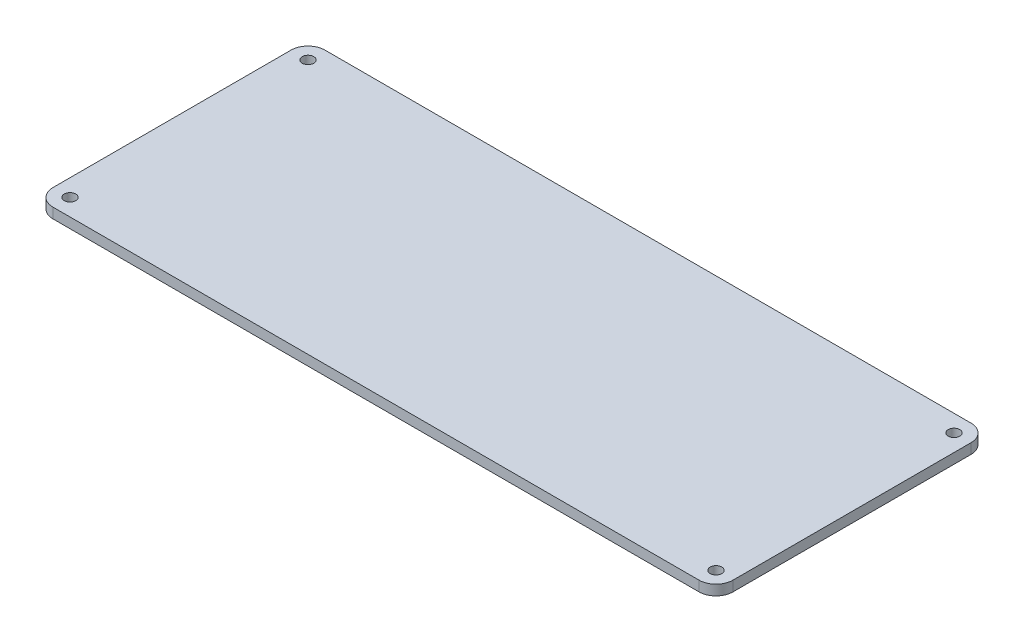
ISO-10303-21;
HEADER;
FILE_DESCRIPTION(('STEP AP214'),'2;1');
FILE_NAME('part.step','',(''),(''),'','','');
FILE_SCHEMA(('AUTOMOTIVE_DESIGN { 1 0 10303 214 1 1 1 1 }'));
ENDSEC;
DATA;
#1=APPLICATION_CONTEXT('core data for automotive mechanical design processes');
#2=APPLICATION_PROTOCOL_DEFINITION('international standard','automotive_design',2000,#1);
#3=PRODUCT_CONTEXT('',#1,'mechanical');
#4=PRODUCT('Part','Part','',(#3));
#5=PRODUCT_RELATED_PRODUCT_CATEGORY('part','',(#4));
#6=PRODUCT_DEFINITION_FORMATION('','',#4);
#7=PRODUCT_DEFINITION_CONTEXT('part definition',#1,'design');
#8=PRODUCT_DEFINITION('design','',#6,#7);
#9=PRODUCT_DEFINITION_SHAPE('','',#8);
#10=(LENGTH_UNIT() NAMED_UNIT(*) SI_UNIT(.MILLI.,.METRE.));
#11=(NAMED_UNIT(*) PLANE_ANGLE_UNIT() SI_UNIT($,.RADIAN.));
#12=(NAMED_UNIT(*) SI_UNIT($,.STERADIAN.) SOLID_ANGLE_UNIT());
#13=UNCERTAINTY_MEASURE_WITH_UNIT(LENGTH_MEASURE(1.E-05),#10,'distance_accuracy_value','');
#14=(GEOMETRIC_REPRESENTATION_CONTEXT(3) GLOBAL_UNCERTAINTY_ASSIGNED_CONTEXT((#13)) GLOBAL_UNIT_ASSIGNED_CONTEXT((#10,
#11,#12)) REPRESENTATION_CONTEXT('',''));
#15=CARTESIAN_POINT('',(0.,0.,0.));
#16=DIRECTION('',(0.,0.,1.));
#17=DIRECTION('',(1.,0.,0.));
#18=AXIS2_PLACEMENT_3D('',#15,#16,#17);
#19=CARTESIAN_POINT('',(0.,3.,0.));
#20=DIRECTION('',(1.,0.,0.));
#21=DIRECTION('',(0.,0.,-1.));
#22=AXIS2_PLACEMENT_3D('',#19,#20,#21);
#23=PLANE('',#22);
#24=DIRECTION('',(0.,0.,1.));
#25=VECTOR('',#24,1.);
#26=CARTESIAN_POINT('',(0.,3.,0.));
#27=LINE('',#26,#25);
#28=CARTESIAN_POINT('',(0.,3.,-75.));
#29=VERTEX_POINT('',#28);
#30=CARTESIAN_POINT('',(0.,3.,-5.));
#31=VERTEX_POINT('',#30);
#32=EDGE_CURVE('E127',#29,#31,#27,.T.);
#33=ORIENTED_EDGE('',*,*,#32,.F.);
#34=DIRECTION('',(0.,-1.,0.));
#35=VECTOR('',#34,1.);
#36=CARTESIAN_POINT('',(0.,3.,-75.));
#37=LINE('',#36,#35);
#38=CARTESIAN_POINT('',(0.,0.,-75.));
#39=VERTEX_POINT('',#38);
#40=EDGE_CURVE('E111',#29,#39,#37,.T.);
#41=ORIENTED_EDGE('',*,*,#40,.T.);
#42=DIRECTION('',(0.,0.,1.));
#43=VECTOR('',#42,1.);
#44=CARTESIAN_POINT('',(0.,0.,0.));
#45=LINE('',#44,#43);
#46=CARTESIAN_POINT('',(0.,0.,-5.));
#47=VERTEX_POINT('',#46);
#48=EDGE_CURVE('E124',#39,#47,#45,.T.);
#49=ORIENTED_EDGE('',*,*,#48,.T.);
#50=DIRECTION('',(0.,-1.,0.));
#51=VECTOR('',#50,1.);
#52=CARTESIAN_POINT('',(0.,3.,-5.));
#53=LINE('',#52,#51);
#54=EDGE_CURVE('E130',#47,#31,#53,.F.);
#55=ORIENTED_EDGE('',*,*,#54,.T.);
#56=EDGE_LOOP('',(#33,#41,#49,#55));
#57=FACE_BOUND('',#56,.T.);
#58=ADVANCED_FACE('F39',(#57),#23,.F.);
#59=CARTESIAN_POINT('',(0.,3.,0.));
#60=DIRECTION('',(0.,0.,-1.));
#61=DIRECTION('',(-1.,0.,0.));
#62=AXIS2_PLACEMENT_3D('',#59,#60,#61);
#63=PLANE('',#62);
#64=DIRECTION('',(1.,0.,0.));
#65=VECTOR('',#64,1.);
#66=CARTESIAN_POINT('',(0.,3.,0.));
#67=LINE('',#66,#65);
#68=CARTESIAN_POINT('',(5.,3.,0.));
#69=VERTEX_POINT('',#68);
#70=CARTESIAN_POINT('',(195.,3.,0.));
#71=VERTEX_POINT('',#70);
#72=EDGE_CURVE('E218',#69,#71,#67,.T.);
#73=ORIENTED_EDGE('',*,*,#72,.F.);
#74=DIRECTION('',(0.,-1.,0.));
#75=VECTOR('',#74,1.);
#76=CARTESIAN_POINT('',(5.,3.,0.));
#77=LINE('',#76,#75);
#78=CARTESIAN_POINT('',(5.,0.,0.));
#79=VERTEX_POINT('',#78);
#80=EDGE_CURVE('E183',#69,#79,#77,.T.);
#81=ORIENTED_EDGE('',*,*,#80,.T.);
#82=DIRECTION('',(1.,0.,0.));
#83=VECTOR('',#82,1.);
#84=CARTESIAN_POINT('',(0.,0.,0.));
#85=LINE('',#84,#83);
#86=CARTESIAN_POINT('',(195.,0.,0.));
#87=VERTEX_POINT('',#86);
#88=EDGE_CURVE('E135',#79,#87,#85,.T.);
#89=ORIENTED_EDGE('',*,*,#88,.T.);
#90=DIRECTION('',(0.,-1.,0.));
#91=VECTOR('',#90,1.);
#92=CARTESIAN_POINT('',(195.,3.,0.));
#93=LINE('',#92,#91);
#94=EDGE_CURVE('E180',#87,#71,#93,.F.);
#95=ORIENTED_EDGE('',*,*,#94,.T.);
#96=EDGE_LOOP('',(#73,#81,#89,#95));
#97=FACE_BOUND('',#96,.T.);
#98=ADVANCED_FACE('F239',(#97),#63,.F.);
#99=CARTESIAN_POINT('',(200.,3.,0.));
#100=DIRECTION('',(-1.,0.,0.));
#101=DIRECTION('',(0.,0.,1.));
#102=AXIS2_PLACEMENT_3D('',#99,#100,#101);
#103=PLANE('',#102);
#104=DIRECTION('',(0.,0.,-1.));
#105=VECTOR('',#104,1.);
#106=CARTESIAN_POINT('',(200.,0.,0.));
#107=LINE('',#106,#105);
#108=CARTESIAN_POINT('',(200.,0.,-5.));
#109=VERTEX_POINT('',#108);
#110=CARTESIAN_POINT('',(200.,0.,-75.));
#111=VERTEX_POINT('',#110);
#112=EDGE_CURVE('E141',#109,#111,#107,.T.);
#113=ORIENTED_EDGE('',*,*,#112,.T.);
#114=DIRECTION('',(0.,-1.,0.));
#115=VECTOR('',#114,1.);
#116=CARTESIAN_POINT('',(200.,3.,-75.));
#117=LINE('',#116,#115);
#118=CARTESIAN_POINT('',(200.,3.,-75.));
#119=VERTEX_POINT('',#118);
#120=EDGE_CURVE('E11',#111,#119,#117,.F.);
#121=ORIENTED_EDGE('',*,*,#120,.T.);
#122=DIRECTION('',(0.,0.,-1.));
#123=VECTOR('',#122,1.);
#124=CARTESIAN_POINT('',(200.,3.,0.));
#125=LINE('',#124,#123);
#126=CARTESIAN_POINT('',(200.,3.,-5.));
#127=VERTEX_POINT('',#126);
#128=EDGE_CURVE('E220',#127,#119,#125,.T.);
#129=ORIENTED_EDGE('',*,*,#128,.F.);
#130=DIRECTION('',(0.,-1.,0.));
#131=VECTOR('',#130,1.);
#132=CARTESIAN_POINT('',(200.,3.,-5.));
#133=LINE('',#132,#131);
#134=EDGE_CURVE('E49',#127,#109,#133,.T.);
#135=ORIENTED_EDGE('',*,*,#134,.T.);
#136=EDGE_LOOP('',(#113,#121,#129,#135));
#137=FACE_BOUND('',#136,.T.);
#138=ADVANCED_FACE('F233',(#137),#103,.F.);
#139=CARTESIAN_POINT('',(0.,3.,-80.));
#140=DIRECTION('',(0.,0.,1.));
#141=DIRECTION('',(1.,0.,0.));
#142=AXIS2_PLACEMENT_3D('',#139,#140,#141);
#143=PLANE('',#142);
#144=DIRECTION('',(-1.,0.,0.));
#145=VECTOR('',#144,1.);
#146=CARTESIAN_POINT('',(0.,0.,-80.));
#147=LINE('',#146,#145);
#148=CARTESIAN_POINT('',(195.,0.,-80.));
#149=VERTEX_POINT('',#148);
#150=CARTESIAN_POINT('',(5.,0.,-80.));
#151=VERTEX_POINT('',#150);
#152=EDGE_CURVE('E152',#149,#151,#147,.T.);
#153=ORIENTED_EDGE('',*,*,#152,.T.);
#154=DIRECTION('',(0.,-1.,0.));
#155=VECTOR('',#154,1.);
#156=CARTESIAN_POINT('',(5.,3.,-80.));
#157=LINE('',#156,#155);
#158=CARTESIAN_POINT('',(5.,3.,-80.));
#159=VERTEX_POINT('',#158);
#160=EDGE_CURVE('E112',#151,#159,#157,.F.);
#161=ORIENTED_EDGE('',*,*,#160,.T.);
#162=DIRECTION('',(-1.,0.,0.));
#163=VECTOR('',#162,1.);
#164=CARTESIAN_POINT('',(0.,3.,-80.));
#165=LINE('',#164,#163);
#166=CARTESIAN_POINT('',(195.,3.,-80.));
#167=VERTEX_POINT('',#166);
#168=EDGE_CURVE('E147',#167,#159,#165,.T.);
#169=ORIENTED_EDGE('',*,*,#168,.F.);
#170=DIRECTION('',(0.,-1.,0.));
#171=VECTOR('',#170,1.);
#172=CARTESIAN_POINT('',(195.,3.,-80.));
#173=LINE('',#172,#171);
#174=EDGE_CURVE('E118',#167,#149,#173,.T.);
#175=ORIENTED_EDGE('',*,*,#174,.T.);
#176=EDGE_LOOP('',(#153,#161,#169,#175));
#177=FACE_BOUND('',#176,.T.);
#178=ADVANCED_FACE('F229',(#177),#143,.F.);
#179=CARTESIAN_POINT('',(0.,3.,0.));
#180=DIRECTION('',(0.,-1.,0.));
#181=DIRECTION('',(0.,0.,-1.));
#182=AXIS2_PLACEMENT_3D('',#179,#180,#181);
#183=PLANE('',#182);
#184=CARTESIAN_POINT('',(195.,3.,-5.));
#185=DIRECTION('',(0.,1.,0.));
#186=DIRECTION('',(0.,0.,1.));
#187=AXIS2_PLACEMENT_3D('',#184,#185,#186);
#188=CIRCLE('',#187,1.69999999999998);
#189=CARTESIAN_POINT('',(195.,3.,-3.30000000000002));
#190=VERTEX_POINT('',#189);
#191=EDGE_CURVE('E210',#190,#190,#188,.T.);
#192=ORIENTED_EDGE('',*,*,#191,.F.);
#193=EDGE_LOOP('',(#192));
#194=FACE_BOUND('',#193,.T.);
#195=CARTESIAN_POINT('',(5.,3.,-5.));
#196=DIRECTION('',(0.,1.,0.));
#197=DIRECTION('',(0.,0.,1.));
#198=AXIS2_PLACEMENT_3D('',#195,#196,#197);
#199=CIRCLE('',#198,1.69999999999999);
#200=CARTESIAN_POINT('',(5.,3.,-3.30000000000001));
#201=VERTEX_POINT('',#200);
#202=EDGE_CURVE('E197',#201,#201,#199,.T.);
#203=ORIENTED_EDGE('',*,*,#202,.F.);
#204=EDGE_LOOP('',(#203));
#205=FACE_BOUND('',#204,.T.);
#206=CARTESIAN_POINT('',(5.,3.,-75.));
#207=DIRECTION('',(0.,1.,0.));
#208=DIRECTION('',(0.,0.,1.));
#209=AXIS2_PLACEMENT_3D('',#206,#207,#208);
#210=CIRCLE('',#209,1.69999999999999);
#211=CARTESIAN_POINT('',(5.,3.,-73.3));
#212=VERTEX_POINT('',#211);
#213=EDGE_CURVE('E193',#212,#212,#210,.T.);
#214=ORIENTED_EDGE('',*,*,#213,.F.);
#215=EDGE_LOOP('',(#214));
#216=FACE_BOUND('',#215,.T.);
#217=CARTESIAN_POINT('',(195.,3.,-75.));
#218=DIRECTION('',(0.,1.,0.));
#219=DIRECTION('',(0.,0.,1.));
#220=AXIS2_PLACEMENT_3D('',#217,#218,#219);
#221=CIRCLE('',#220,1.69999999999998);
#222=CARTESIAN_POINT('',(195.,3.,-73.3));
#223=VERTEX_POINT('',#222);
#224=EDGE_CURVE('E144',#223,#223,#221,.T.);
#225=ORIENTED_EDGE('',*,*,#224,.F.);
#226=EDGE_LOOP('',(#225));
#227=FACE_BOUND('',#226,.T.);
#228=ORIENTED_EDGE('',*,*,#168,.T.);
#229=CARTESIAN_POINT('',(5.,3.,-75.));
#230=DIRECTION('',(0.,-1.,0.));
#231=DIRECTION('',(0.,0.,-1.));
#232=AXIS2_PLACEMENT_3D('',#229,#230,#231);
#233=CIRCLE('',#232,5.);
#234=EDGE_CURVE('E177',#159,#29,#233,.F.);
#235=ORIENTED_EDGE('',*,*,#234,.T.);
#236=ORIENTED_EDGE('',*,*,#32,.T.);
#237=CARTESIAN_POINT('',(5.,3.,-5.));
#238=DIRECTION('',(0.,-1.,0.));
#239=DIRECTION('',(0.,0.,-1.));
#240=AXIS2_PLACEMENT_3D('',#237,#238,#239);
#241=CIRCLE('',#240,5.);
#242=EDGE_CURVE('E174',#31,#69,#241,.F.);
#243=ORIENTED_EDGE('',*,*,#242,.T.);
#244=ORIENTED_EDGE('',*,*,#72,.T.);
#245=CARTESIAN_POINT('',(195.,3.,-5.));
#246=DIRECTION('',(0.,-1.,0.));
#247=DIRECTION('',(0.,0.,-1.));
#248=AXIS2_PLACEMENT_3D('',#245,#246,#247);
#249=CIRCLE('',#248,5.);
#250=EDGE_CURVE('E62',#71,#127,#249,.F.);
#251=ORIENTED_EDGE('',*,*,#250,.T.);
#252=ORIENTED_EDGE('',*,*,#128,.T.);
#253=CARTESIAN_POINT('',(195.,3.,-75.));
#254=DIRECTION('',(0.,-1.,0.));
#255=DIRECTION('',(0.,0.,-1.));
#256=AXIS2_PLACEMENT_3D('',#253,#254,#255);
#257=CIRCLE('',#256,5.);
#258=EDGE_CURVE('E171',#119,#167,#257,.F.);
#259=ORIENTED_EDGE('',*,*,#258,.T.);
#260=EDGE_LOOP('',(#228,#235,#236,#243,#244,#251,#252,#259));
#261=FACE_BOUND('',#260,.T.);
#262=ADVANCED_FACE('F226',(#194,#205,#216,#227,#261),#183,.F.);
#263=CARTESIAN_POINT('',(0.,0.,0.));
#264=DIRECTION('',(0.,-1.,0.));
#265=DIRECTION('',(0.,0.,-1.));
#266=AXIS2_PLACEMENT_3D('',#263,#264,#265);
#267=PLANE('',#266);
#268=CARTESIAN_POINT('',(195.,0.,-5.));
#269=DIRECTION('',(0.,-1.,0.));
#270=DIRECTION('',(0.,0.,-1.));
#271=AXIS2_PLACEMENT_3D('',#268,#269,#270);
#272=CIRCLE('',#271,1.69999999999998);
#273=CARTESIAN_POINT('',(195.,0.,-6.69999999999998));
#274=VERTEX_POINT('',#273);
#275=EDGE_CURVE('E43',#274,#274,#272,.T.);
#276=ORIENTED_EDGE('',*,*,#275,.F.);
#277=EDGE_LOOP('',(#276));
#278=FACE_BOUND('',#277,.T.);
#279=CARTESIAN_POINT('',(5.,0.,-5.));
#280=DIRECTION('',(0.,-1.,0.));
#281=DIRECTION('',(0.,0.,-1.));
#282=AXIS2_PLACEMENT_3D('',#279,#280,#281);
#283=CIRCLE('',#282,1.69999999999999);
#284=CARTESIAN_POINT('',(5.,0.,-6.69999999999999));
#285=VERTEX_POINT('',#284);
#286=EDGE_CURVE('E194',#285,#285,#283,.T.);
#287=ORIENTED_EDGE('',*,*,#286,.F.);
#288=EDGE_LOOP('',(#287));
#289=FACE_BOUND('',#288,.T.);
#290=CARTESIAN_POINT('',(5.,0.,-75.));
#291=DIRECTION('',(0.,-1.,0.));
#292=DIRECTION('',(0.,0.,-1.));
#293=AXIS2_PLACEMENT_3D('',#290,#291,#292);
#294=CIRCLE('',#293,1.69999999999999);
#295=CARTESIAN_POINT('',(5.,0.,-76.7));
#296=VERTEX_POINT('',#295);
#297=EDGE_CURVE('E190',#296,#296,#294,.T.);
#298=ORIENTED_EDGE('',*,*,#297,.F.);
#299=EDGE_LOOP('',(#298));
#300=FACE_BOUND('',#299,.T.);
#301=CARTESIAN_POINT('',(195.,0.,-75.));
#302=DIRECTION('',(0.,-1.,0.));
#303=DIRECTION('',(0.,0.,-1.));
#304=AXIS2_PLACEMENT_3D('',#301,#302,#303);
#305=CIRCLE('',#304,1.69999999999998);
#306=CARTESIAN_POINT('',(195.,0.,-76.7));
#307=VERTEX_POINT('',#306);
#308=EDGE_CURVE('E136',#307,#307,#305,.T.);
#309=ORIENTED_EDGE('',*,*,#308,.F.);
#310=EDGE_LOOP('',(#309));
#311=FACE_BOUND('',#310,.T.);
#312=ORIENTED_EDGE('',*,*,#48,.F.);
#313=CARTESIAN_POINT('',(5.,0.,-75.));
#314=DIRECTION('',(0.,-1.,0.));
#315=DIRECTION('',(0.,0.,-1.));
#316=AXIS2_PLACEMENT_3D('',#313,#314,#315);
#317=CIRCLE('',#316,5.);
#318=EDGE_CURVE('E107',#39,#151,#317,.T.);
#319=ORIENTED_EDGE('',*,*,#318,.T.);
#320=ORIENTED_EDGE('',*,*,#152,.F.);
#321=CARTESIAN_POINT('',(195.,0.,-75.));
#322=DIRECTION('',(0.,-1.,0.));
#323=DIRECTION('',(0.,0.,-1.));
#324=AXIS2_PLACEMENT_3D('',#321,#322,#323);
#325=CIRCLE('',#324,5.);
#326=EDGE_CURVE('E159',#149,#111,#325,.T.);
#327=ORIENTED_EDGE('',*,*,#326,.T.);
#328=ORIENTED_EDGE('',*,*,#112,.F.);
#329=CARTESIAN_POINT('',(195.,0.,-5.));
#330=DIRECTION('',(0.,-1.,0.));
#331=DIRECTION('',(0.,0.,-1.));
#332=AXIS2_PLACEMENT_3D('',#329,#330,#331);
#333=CIRCLE('',#332,5.);
#334=EDGE_CURVE('E129',#109,#87,#333,.T.);
#335=ORIENTED_EDGE('',*,*,#334,.T.);
#336=ORIENTED_EDGE('',*,*,#88,.F.);
#337=CARTESIAN_POINT('',(5.,0.,-5.));
#338=DIRECTION('',(0.,-1.,0.));
#339=DIRECTION('',(0.,0.,-1.));
#340=AXIS2_PLACEMENT_3D('',#337,#338,#339);
#341=CIRCLE('',#340,5.);
#342=EDGE_CURVE('E119',#79,#47,#341,.T.);
#343=ORIENTED_EDGE('',*,*,#342,.T.);
#344=EDGE_LOOP('',(#312,#319,#320,#327,#328,#335,#336,#343));
#345=FACE_BOUND('',#344,.T.);
#346=ADVANCED_FACE('F132',(#278,#289,#300,#311,#345),#267,.T.);
#347=CARTESIAN_POINT('',(5.,3.,-75.));
#348=DIRECTION('',(0.,-1.,0.));
#349=DIRECTION('',(0.,0.,-1.));
#350=AXIS2_PLACEMENT_3D('',#347,#348,#349);
#351=CYLINDRICAL_SURFACE('',#350,5.);
#352=ORIENTED_EDGE('',*,*,#234,.F.);
#353=ORIENTED_EDGE('',*,*,#160,.F.);
#354=ORIENTED_EDGE('',*,*,#318,.F.);
#355=ORIENTED_EDGE('',*,*,#40,.F.);
#356=EDGE_LOOP('',(#352,#353,#354,#355));
#357=FACE_BOUND('',#356,.T.);
#358=ADVANCED_FACE('F110',(#357),#351,.T.);
#359=CARTESIAN_POINT('',(5.,3.,-5.));
#360=DIRECTION('',(0.,-1.,0.));
#361=DIRECTION('',(0.,0.,-1.));
#362=AXIS2_PLACEMENT_3D('',#359,#360,#361);
#363=CYLINDRICAL_SURFACE('',#362,5.);
#364=ORIENTED_EDGE('',*,*,#242,.F.);
#365=ORIENTED_EDGE('',*,*,#54,.F.);
#366=ORIENTED_EDGE('',*,*,#342,.F.);
#367=ORIENTED_EDGE('',*,*,#80,.F.);
#368=EDGE_LOOP('',(#364,#365,#366,#367));
#369=FACE_BOUND('',#368,.T.);
#370=ADVANCED_FACE('F243',(#369),#363,.T.);
#371=CARTESIAN_POINT('',(195.,3.,-75.));
#372=DIRECTION('',(0.,-1.,0.));
#373=DIRECTION('',(0.,0.,-1.));
#374=AXIS2_PLACEMENT_3D('',#371,#372,#373);
#375=CYLINDRICAL_SURFACE('',#374,5.);
#376=ORIENTED_EDGE('',*,*,#258,.F.);
#377=ORIENTED_EDGE('',*,*,#120,.F.);
#378=ORIENTED_EDGE('',*,*,#326,.F.);
#379=ORIENTED_EDGE('',*,*,#174,.F.);
#380=EDGE_LOOP('',(#376,#377,#378,#379));
#381=FACE_BOUND('',#380,.T.);
#382=ADVANCED_FACE('F231',(#381),#375,.T.);
#383=CARTESIAN_POINT('',(195.,3.,-5.));
#384=DIRECTION('',(0.,-1.,0.));
#385=DIRECTION('',(0.,0.,-1.));
#386=AXIS2_PLACEMENT_3D('',#383,#384,#385);
#387=CYLINDRICAL_SURFACE('',#386,5.);
#388=ORIENTED_EDGE('',*,*,#250,.F.);
#389=ORIENTED_EDGE('',*,*,#94,.F.);
#390=ORIENTED_EDGE('',*,*,#334,.F.);
#391=ORIENTED_EDGE('',*,*,#134,.F.);
#392=EDGE_LOOP('',(#388,#389,#390,#391));
#393=FACE_BOUND('',#392,.T.);
#394=ADVANCED_FACE('F41',(#393),#387,.T.);
#395=CARTESIAN_POINT('',(195.,3.,-75.));
#396=DIRECTION('',(0.,1.,0.));
#397=DIRECTION('',(0.,0.,1.));
#398=AXIS2_PLACEMENT_3D('',#395,#396,#397);
#399=CYLINDRICAL_SURFACE('',#398,1.69999999999998);
#400=ORIENTED_EDGE('',*,*,#308,.T.);
#401=EDGE_LOOP('',(#400));
#402=FACE_BOUND('',#401,.T.);
#403=ORIENTED_EDGE('',*,*,#224,.T.);
#404=EDGE_LOOP('',(#403));
#405=FACE_BOUND('',#404,.T.);
#406=ADVANCED_FACE('F268',(#402,#405),#399,.F.);
#407=CARTESIAN_POINT('',(5.,3.,-75.));
#408=DIRECTION('',(0.,1.,0.));
#409=DIRECTION('',(0.,0.,1.));
#410=AXIS2_PLACEMENT_3D('',#407,#408,#409);
#411=CYLINDRICAL_SURFACE('',#410,1.69999999999999);
#412=ORIENTED_EDGE('',*,*,#297,.T.);
#413=EDGE_LOOP('',(#412));
#414=FACE_BOUND('',#413,.T.);
#415=ORIENTED_EDGE('',*,*,#213,.T.);
#416=EDGE_LOOP('',(#415));
#417=FACE_BOUND('',#416,.T.);
#418=ADVANCED_FACE('F271',(#414,#417),#411,.F.);
#419=CARTESIAN_POINT('',(5.,3.,-5.));
#420=DIRECTION('',(0.,1.,0.));
#421=DIRECTION('',(0.,0.,1.));
#422=AXIS2_PLACEMENT_3D('',#419,#420,#421);
#423=CYLINDRICAL_SURFACE('',#422,1.69999999999999);
#424=ORIENTED_EDGE('',*,*,#286,.T.);
#425=EDGE_LOOP('',(#424));
#426=FACE_BOUND('',#425,.T.);
#427=ORIENTED_EDGE('',*,*,#202,.T.);
#428=EDGE_LOOP('',(#427));
#429=FACE_BOUND('',#428,.T.);
#430=ADVANCED_FACE('F275',(#426,#429),#423,.F.);
#431=CARTESIAN_POINT('',(195.,3.,-5.));
#432=DIRECTION('',(0.,1.,0.));
#433=DIRECTION('',(0.,0.,1.));
#434=AXIS2_PLACEMENT_3D('',#431,#432,#433);
#435=CYLINDRICAL_SURFACE('',#434,1.69999999999998);
#436=ORIENTED_EDGE('',*,*,#275,.T.);
#437=EDGE_LOOP('',(#436));
#438=FACE_BOUND('',#437,.T.);
#439=ORIENTED_EDGE('',*,*,#191,.T.);
#440=EDGE_LOOP('',(#439));
#441=FACE_BOUND('',#440,.T.);
#442=ADVANCED_FACE('F279',(#438,#441),#435,.F.);
#443=CLOSED_SHELL('',(#58,#98,#138,#178,#262,#346,#358,#370,#382,#394,#406,#418,#430,#442));
#444=MANIFOLD_SOLID_BREP('B2',#443);
#445=ADVANCED_BREP_SHAPE_REPRESENTATION('',(#18,#444),#14);
#446=SHAPE_DEFINITION_REPRESENTATION(#9,#445);
ENDSEC;
END-ISO-10303-21;
